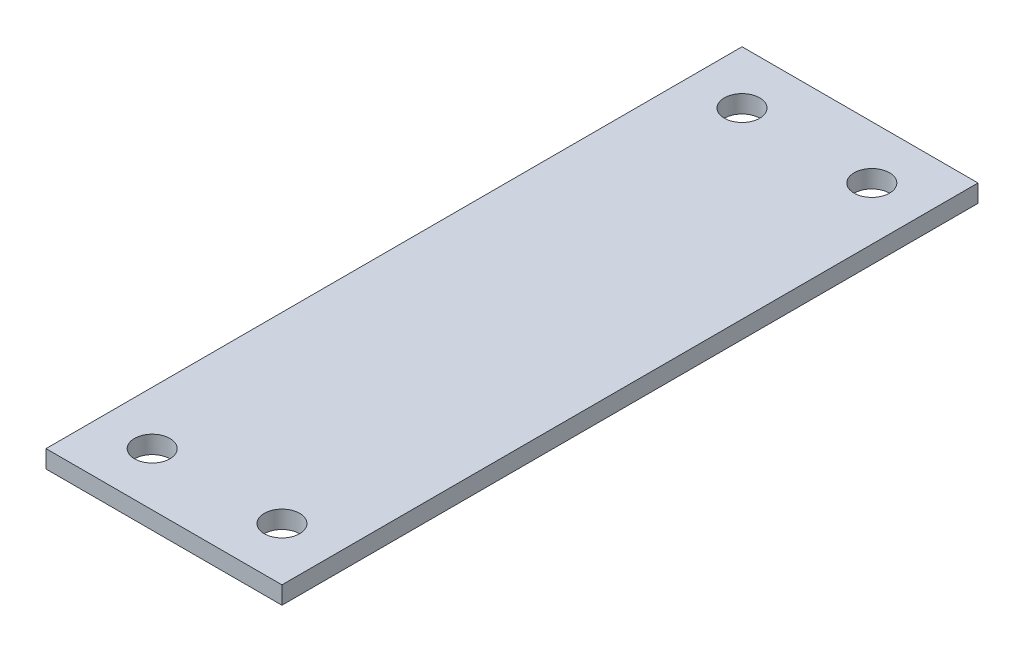
ISO-10303-21;
HEADER;
FILE_DESCRIPTION(('STEP AP214'),'2;1');
FILE_NAME('part.step','',(''),(''),'','','');
FILE_SCHEMA(('AUTOMOTIVE_DESIGN { 1 0 10303 214 1 1 1 1 }'));
ENDSEC;
DATA;
#1=APPLICATION_CONTEXT('core data for automotive mechanical design processes');
#2=APPLICATION_PROTOCOL_DEFINITION('international standard','automotive_design',2000,#1);
#3=PRODUCT_CONTEXT('',#1,'mechanical');
#4=PRODUCT('Part','Part','',(#3));
#5=PRODUCT_RELATED_PRODUCT_CATEGORY('part','',(#4));
#6=PRODUCT_DEFINITION_FORMATION('','',#4);
#7=PRODUCT_DEFINITION_CONTEXT('part definition',#1,'design');
#8=PRODUCT_DEFINITION('design','',#6,#7);
#9=PRODUCT_DEFINITION_SHAPE('','',#8);
#10=(LENGTH_UNIT() NAMED_UNIT(*) SI_UNIT(.MILLI.,.METRE.));
#11=(NAMED_UNIT(*) PLANE_ANGLE_UNIT() SI_UNIT($,.RADIAN.));
#12=(NAMED_UNIT(*) SI_UNIT($,.STERADIAN.) SOLID_ANGLE_UNIT());
#13=UNCERTAINTY_MEASURE_WITH_UNIT(LENGTH_MEASURE(1.E-05),#10,'distance_accuracy_value','');
#14=(GEOMETRIC_REPRESENTATION_CONTEXT(3) GLOBAL_UNCERTAINTY_ASSIGNED_CONTEXT((#13)) GLOBAL_UNIT_ASSIGNED_CONTEXT((#10,
#11,#12)) REPRESENTATION_CONTEXT('',''));
#15=CARTESIAN_POINT('',(0.,0.,0.));
#16=DIRECTION('',(0.,0.,1.));
#17=DIRECTION('',(1.,0.,0.));
#18=AXIS2_PLACEMENT_3D('',#15,#16,#17);
#19=CARTESIAN_POINT('',(0.,0.,0.));
#20=DIRECTION('',(0.,1.,0.));
#21=DIRECTION('',(0.,0.,1.));
#22=AXIS2_PLACEMENT_3D('',#19,#20,#21);
#23=PLANE('',#22);
#24=CARTESIAN_POINT('',(-5.49999999999999,0.,25.));
#25=DIRECTION('',(0.,-1.,0.));
#26=DIRECTION('',(0.,0.,-1.));
#27=AXIS2_PLACEMENT_3D('',#24,#25,#26);
#28=CIRCLE('',#27,1.49999999999999);
#29=CARTESIAN_POINT('',(-5.49999999999999,0.,23.5));
#30=VERTEX_POINT('',#29);
#31=EDGE_CURVE('E134',#30,#30,#28,.T.);
#32=ORIENTED_EDGE('',*,*,#31,.F.);
#33=EDGE_LOOP('',(#32));
#34=FACE_BOUND('',#33,.T.);
#35=CARTESIAN_POINT('',(5.5,0.,25.));
#36=DIRECTION('',(0.,-1.,0.));
#37=DIRECTION('',(0.,0.,-1.));
#38=AXIS2_PLACEMENT_3D('',#35,#36,#37);
#39=CIRCLE('',#38,1.49999999999999);
#40=CARTESIAN_POINT('',(5.5,0.,23.5));
#41=VERTEX_POINT('',#40);
#42=EDGE_CURVE('E128',#41,#41,#39,.T.);
#43=ORIENTED_EDGE('',*,*,#42,.F.);
#44=EDGE_LOOP('',(#43));
#45=FACE_BOUND('',#44,.T.);
#46=CARTESIAN_POINT('',(-5.5,0.,-25.));
#47=DIRECTION('',(0.,-1.,0.));
#48=DIRECTION('',(0.,0.,-1.));
#49=AXIS2_PLACEMENT_3D('',#46,#47,#48);
#50=CIRCLE('',#49,1.49999999999999);
#51=CARTESIAN_POINT('',(-5.5,0.,-26.5));
#52=VERTEX_POINT('',#51);
#53=EDGE_CURVE('E122',#52,#52,#50,.T.);
#54=ORIENTED_EDGE('',*,*,#53,.F.);
#55=EDGE_LOOP('',(#54));
#56=FACE_BOUND('',#55,.T.);
#57=DIRECTION('',(0.,0.,-1.));
#58=VECTOR('',#57,1.);
#59=CARTESIAN_POINT('',(10.,0.,-29.5));
#60=LINE('',#59,#58);
#61=CARTESIAN_POINT('',(10.,0.,29.5));
#62=VERTEX_POINT('',#61);
#63=CARTESIAN_POINT('',(10.,0.,-29.5));
#64=VERTEX_POINT('',#63);
#65=EDGE_CURVE('E100',#62,#64,#60,.T.);
#66=ORIENTED_EDGE('',*,*,#65,.F.);
#67=DIRECTION('',(1.,0.,0.));
#68=VECTOR('',#67,1.);
#69=CARTESIAN_POINT('',(-9.99999999999999,0.,29.5));
#70=LINE('',#69,#68);
#71=CARTESIAN_POINT('',(-9.99999999999999,0.,29.5));
#72=VERTEX_POINT('',#71);
#73=EDGE_CURVE('E76',#72,#62,#70,.T.);
#74=ORIENTED_EDGE('',*,*,#73,.F.);
#75=DIRECTION('',(0.,0.,1.));
#76=VECTOR('',#75,1.);
#77=CARTESIAN_POINT('',(-10.,0.,-29.5));
#78=LINE('',#77,#76);
#79=CARTESIAN_POINT('',(-10.,0.,-29.5));
#80=VERTEX_POINT('',#79);
#81=EDGE_CURVE('E70',#80,#72,#78,.T.);
#82=ORIENTED_EDGE('',*,*,#81,.F.);
#83=DIRECTION('',(-1.,0.,0.));
#84=VECTOR('',#83,1.);
#85=CARTESIAN_POINT('',(-10.,0.,-29.5));
#86=LINE('',#85,#84);
#87=EDGE_CURVE('E92',#64,#80,#86,.T.);
#88=ORIENTED_EDGE('',*,*,#87,.F.);
#89=EDGE_LOOP('',(#66,#74,#82,#88));
#90=FACE_BOUND('',#89,.T.);
#91=CARTESIAN_POINT('',(5.5,0.,-25.));
#92=DIRECTION('',(0.,-1.,0.));
#93=DIRECTION('',(0.,0.,-1.));
#94=AXIS2_PLACEMENT_3D('',#91,#92,#93);
#95=CIRCLE('',#94,1.49999999999999);
#96=CARTESIAN_POINT('',(5.5,0.,-26.5));
#97=VERTEX_POINT('',#96);
#98=EDGE_CURVE('E116',#97,#97,#95,.T.);
#99=ORIENTED_EDGE('',*,*,#98,.F.);
#100=EDGE_LOOP('',(#99));
#101=FACE_BOUND('',#100,.T.);
#102=ADVANCED_FACE('F36',(#34,#45,#56,#90,#101),#23,.F.);
#103=CARTESIAN_POINT('',(10.,1.5,-29.5));
#104=DIRECTION('',(-1.,0.,0.));
#105=DIRECTION('',(0.,0.,1.));
#106=AXIS2_PLACEMENT_3D('',#103,#104,#105);
#107=PLANE('',#106);
#108=ORIENTED_EDGE('',*,*,#65,.T.);
#109=DIRECTION('',(0.,-1.,0.));
#110=VECTOR('',#109,1.);
#111=CARTESIAN_POINT('',(10.,1.5,-29.5));
#112=LINE('',#111,#110);
#113=CARTESIAN_POINT('',(10.,1.5,-29.5));
#114=VERTEX_POINT('',#113);
#115=EDGE_CURVE('E11',#114,#64,#112,.T.);
#116=ORIENTED_EDGE('',*,*,#115,.F.);
#117=DIRECTION('',(0.,0.,-1.));
#118=VECTOR('',#117,1.);
#119=CARTESIAN_POINT('',(10.,1.5,-29.5));
#120=LINE('',#119,#118);
#121=CARTESIAN_POINT('',(10.,1.5,29.5));
#122=VERTEX_POINT('',#121);
#123=EDGE_CURVE('E88',#122,#114,#120,.T.);
#124=ORIENTED_EDGE('',*,*,#123,.F.);
#125=DIRECTION('',(0.,-1.,0.));
#126=VECTOR('',#125,1.);
#127=CARTESIAN_POINT('',(10.,1.5,29.5));
#128=LINE('',#127,#126);
#129=EDGE_CURVE('E96',#122,#62,#128,.T.);
#130=ORIENTED_EDGE('',*,*,#129,.T.);
#131=EDGE_LOOP('',(#108,#116,#124,#130));
#132=FACE_BOUND('',#131,.T.);
#133=ADVANCED_FACE('F38',(#132),#107,.F.);
#134=CARTESIAN_POINT('',(-10.,1.5,-29.5));
#135=DIRECTION('',(0.,0.,1.));
#136=DIRECTION('',(1.,0.,0.));
#137=AXIS2_PLACEMENT_3D('',#134,#135,#136);
#138=PLANE('',#137);
#139=ORIENTED_EDGE('',*,*,#87,.T.);
#140=DIRECTION('',(0.,-1.,0.));
#141=VECTOR('',#140,1.);
#142=CARTESIAN_POINT('',(-10.,1.5,-29.5));
#143=LINE('',#142,#141);
#144=CARTESIAN_POINT('',(-10.,1.5,-29.5));
#145=VERTEX_POINT('',#144);
#146=EDGE_CURVE('E45',#145,#80,#143,.T.);
#147=ORIENTED_EDGE('',*,*,#146,.F.);
#148=DIRECTION('',(-1.,0.,0.));
#149=VECTOR('',#148,1.);
#150=CARTESIAN_POINT('',(-10.,1.5,-29.5));
#151=LINE('',#150,#149);
#152=EDGE_CURVE('E83',#114,#145,#151,.T.);
#153=ORIENTED_EDGE('',*,*,#152,.F.);
#154=ORIENTED_EDGE('',*,*,#115,.T.);
#155=EDGE_LOOP('',(#139,#147,#153,#154));
#156=FACE_BOUND('',#155,.T.);
#157=ADVANCED_FACE('F91',(#156),#138,.F.);
#158=CARTESIAN_POINT('',(-10.,1.5,-29.5));
#159=DIRECTION('',(1.,0.,0.));
#160=DIRECTION('',(0.,0.,-1.));
#161=AXIS2_PLACEMENT_3D('',#158,#159,#160);
#162=PLANE('',#161);
#163=ORIENTED_EDGE('',*,*,#81,.T.);
#164=DIRECTION('',(0.,-1.,0.));
#165=VECTOR('',#164,1.);
#166=CARTESIAN_POINT('',(-9.99999999999999,1.5,29.5));
#167=LINE('',#166,#165);
#168=CARTESIAN_POINT('',(-9.99999999999999,1.5,29.5));
#169=VERTEX_POINT('',#168);
#170=EDGE_CURVE('E93',#169,#72,#167,.T.);
#171=ORIENTED_EDGE('',*,*,#170,.F.);
#172=DIRECTION('',(0.,0.,1.));
#173=VECTOR('',#172,1.);
#174=CARTESIAN_POINT('',(-10.,1.5,-29.5));
#175=LINE('',#174,#173);
#176=EDGE_CURVE('E86',#145,#169,#175,.T.);
#177=ORIENTED_EDGE('',*,*,#176,.F.);
#178=ORIENTED_EDGE('',*,*,#146,.T.);
#179=EDGE_LOOP('',(#163,#171,#177,#178));
#180=FACE_BOUND('',#179,.T.);
#181=ADVANCED_FACE('F94',(#180),#162,.F.);
#182=CARTESIAN_POINT('',(-9.99999999999999,1.5,29.5));
#183=DIRECTION('',(0.,0.,-1.));
#184=DIRECTION('',(-1.,0.,0.));
#185=AXIS2_PLACEMENT_3D('',#182,#183,#184);
#186=PLANE('',#185);
#187=ORIENTED_EDGE('',*,*,#73,.T.);
#188=ORIENTED_EDGE('',*,*,#129,.F.);
#189=DIRECTION('',(1.,0.,0.));
#190=VECTOR('',#189,1.);
#191=CARTESIAN_POINT('',(-9.99999999999999,1.5,29.5));
#192=LINE('',#191,#190);
#193=EDGE_CURVE('E53',#169,#122,#192,.T.);
#194=ORIENTED_EDGE('',*,*,#193,.F.);
#195=ORIENTED_EDGE('',*,*,#170,.T.);
#196=EDGE_LOOP('',(#187,#188,#194,#195));
#197=FACE_BOUND('',#196,.T.);
#198=ADVANCED_FACE('F108',(#197),#186,.F.);
#199=CARTESIAN_POINT('',(0.,1.5,0.));
#200=DIRECTION('',(0.,1.,0.));
#201=DIRECTION('',(0.,0.,1.));
#202=AXIS2_PLACEMENT_3D('',#199,#200,#201);
#203=PLANE('',#202);
#204=CARTESIAN_POINT('',(-5.49999999999999,1.5,25.));
#205=DIRECTION('',(0.,-1.,0.));
#206=DIRECTION('',(0.,0.,-1.));
#207=AXIS2_PLACEMENT_3D('',#204,#205,#206);
#208=CIRCLE('',#207,1.5);
#209=CARTESIAN_POINT('',(-5.49999999999999,1.5,23.5));
#210=VERTEX_POINT('',#209);
#211=EDGE_CURVE('E131',#210,#210,#208,.T.);
#212=ORIENTED_EDGE('',*,*,#211,.T.);
#213=EDGE_LOOP('',(#212));
#214=FACE_BOUND('',#213,.T.);
#215=CARTESIAN_POINT('',(5.5,1.5,25.));
#216=DIRECTION('',(0.,-1.,0.));
#217=DIRECTION('',(0.,0.,-1.));
#218=AXIS2_PLACEMENT_3D('',#215,#216,#217);
#219=CIRCLE('',#218,1.5);
#220=CARTESIAN_POINT('',(5.5,1.5,23.5));
#221=VERTEX_POINT('',#220);
#222=EDGE_CURVE('E125',#221,#221,#219,.T.);
#223=ORIENTED_EDGE('',*,*,#222,.T.);
#224=EDGE_LOOP('',(#223));
#225=FACE_BOUND('',#224,.T.);
#226=CARTESIAN_POINT('',(-5.5,1.5,-25.));
#227=DIRECTION('',(0.,-1.,0.));
#228=DIRECTION('',(0.,0.,-1.));
#229=AXIS2_PLACEMENT_3D('',#226,#227,#228);
#230=CIRCLE('',#229,1.5);
#231=CARTESIAN_POINT('',(-5.5,1.5,-26.5));
#232=VERTEX_POINT('',#231);
#233=EDGE_CURVE('E119',#232,#232,#230,.T.);
#234=ORIENTED_EDGE('',*,*,#233,.T.);
#235=EDGE_LOOP('',(#234));
#236=FACE_BOUND('',#235,.T.);
#237=CARTESIAN_POINT('',(5.5,1.5,-25.));
#238=DIRECTION('',(0.,-1.,0.));
#239=DIRECTION('',(0.,0.,-1.));
#240=AXIS2_PLACEMENT_3D('',#237,#238,#239);
#241=CIRCLE('',#240,1.5);
#242=CARTESIAN_POINT('',(5.5,1.5,-26.5));
#243=VERTEX_POINT('',#242);
#244=EDGE_CURVE('E103',#243,#243,#241,.T.);
#245=ORIENTED_EDGE('',*,*,#244,.T.);
#246=EDGE_LOOP('',(#245));
#247=FACE_BOUND('',#246,.T.);
#248=ORIENTED_EDGE('',*,*,#123,.T.);
#249=ORIENTED_EDGE('',*,*,#152,.T.);
#250=ORIENTED_EDGE('',*,*,#176,.T.);
#251=ORIENTED_EDGE('',*,*,#193,.T.);
#252=EDGE_LOOP('',(#248,#249,#250,#251));
#253=FACE_BOUND('',#252,.T.);
#254=ADVANCED_FACE('F84',(#214,#225,#236,#247,#253),#203,.T.);
#255=CARTESIAN_POINT('',(5.5,0.,-25.));
#256=DIRECTION('',(0.,-1.,0.));
#257=DIRECTION('',(0.,0.,-1.));
#258=AXIS2_PLACEMENT_3D('',#255,#256,#257);
#259=CYLINDRICAL_SURFACE('',#258,1.49999999999999);
#260=ORIENTED_EDGE('',*,*,#244,.F.);
#261=EDGE_LOOP('',(#260));
#262=FACE_BOUND('',#261,.T.);
#263=ORIENTED_EDGE('',*,*,#98,.T.);
#264=EDGE_LOOP('',(#263));
#265=FACE_BOUND('',#264,.T.);
#266=ADVANCED_FACE('F150',(#262,#265),#259,.F.);
#267=CARTESIAN_POINT('',(-5.5,0.,-25.));
#268=DIRECTION('',(0.,-1.,0.));
#269=DIRECTION('',(0.,0.,-1.));
#270=AXIS2_PLACEMENT_3D('',#267,#268,#269);
#271=CYLINDRICAL_SURFACE('',#270,1.49999999999999);
#272=ORIENTED_EDGE('',*,*,#233,.F.);
#273=EDGE_LOOP('',(#272));
#274=FACE_BOUND('',#273,.T.);
#275=ORIENTED_EDGE('',*,*,#53,.T.);
#276=EDGE_LOOP('',(#275));
#277=FACE_BOUND('',#276,.T.);
#278=ADVANCED_FACE('F147',(#274,#277),#271,.F.);
#279=CARTESIAN_POINT('',(5.5,0.,25.));
#280=DIRECTION('',(0.,-1.,0.));
#281=DIRECTION('',(0.,0.,-1.));
#282=AXIS2_PLACEMENT_3D('',#279,#280,#281);
#283=CYLINDRICAL_SURFACE('',#282,1.49999999999999);
#284=ORIENTED_EDGE('',*,*,#222,.F.);
#285=EDGE_LOOP('',(#284));
#286=FACE_BOUND('',#285,.T.);
#287=ORIENTED_EDGE('',*,*,#42,.T.);
#288=EDGE_LOOP('',(#287));
#289=FACE_BOUND('',#288,.T.);
#290=ADVANCED_FACE('F149',(#286,#289),#283,.F.);
#291=CARTESIAN_POINT('',(-5.49999999999999,0.,25.));
#292=DIRECTION('',(0.,-1.,0.));
#293=DIRECTION('',(0.,0.,-1.));
#294=AXIS2_PLACEMENT_3D('',#291,#292,#293);
#295=CYLINDRICAL_SURFACE('',#294,1.49999999999999);
#296=ORIENTED_EDGE('',*,*,#211,.F.);
#297=EDGE_LOOP('',(#296));
#298=FACE_BOUND('',#297,.T.);
#299=ORIENTED_EDGE('',*,*,#31,.T.);
#300=EDGE_LOOP('',(#299));
#301=FACE_BOUND('',#300,.T.);
#302=ADVANCED_FACE('F138',(#298,#301),#295,.F.);
#303=CLOSED_SHELL('',(#102,#133,#157,#181,#198,#254,#266,#278,#290,#302));
#304=MANIFOLD_SOLID_BREP('B2',#303);
#305=ADVANCED_BREP_SHAPE_REPRESENTATION('',(#18,#304),#14);
#306=SHAPE_DEFINITION_REPRESENTATION(#9,#305);
ENDSEC;
END-ISO-10303-21;
